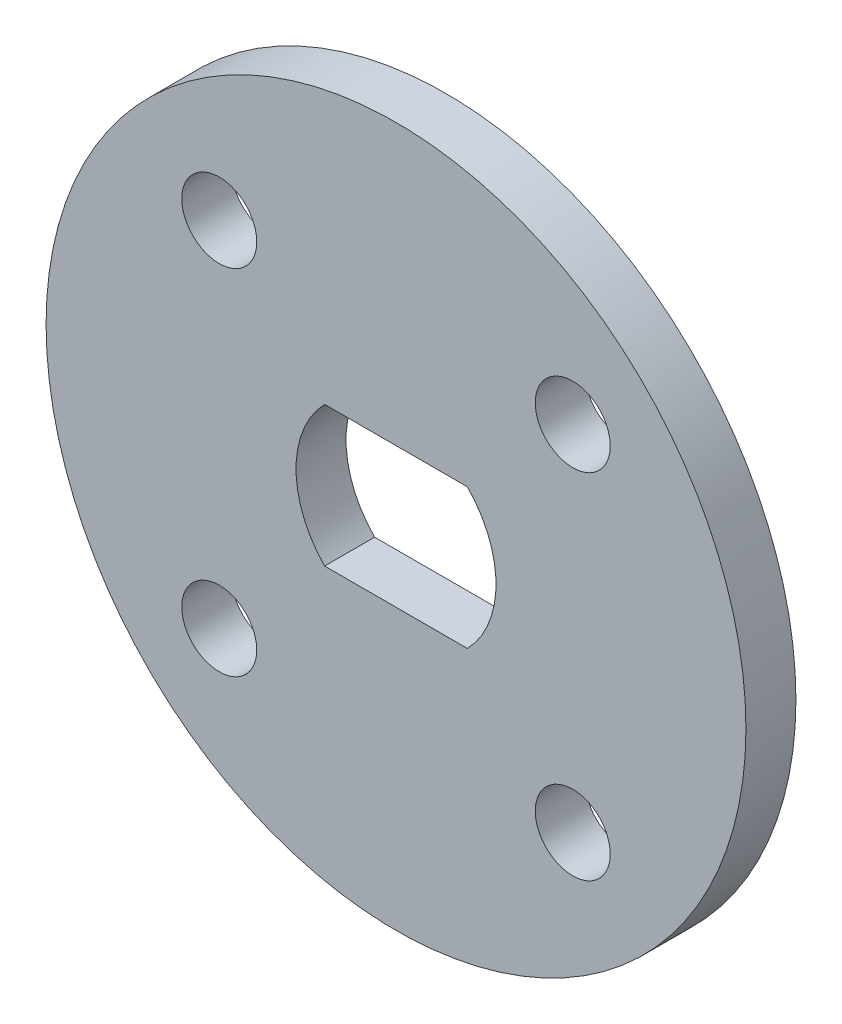
ISO-10303-21;
HEADER;
FILE_DESCRIPTION(('STEP AP214'),'2;1');
FILE_NAME('part.step','',(''),(''),'','','');
FILE_SCHEMA(('AUTOMOTIVE_DESIGN { 1 0 10303 214 1 1 1 1 }'));
ENDSEC;
DATA;
#1=APPLICATION_CONTEXT('core data for automotive mechanical design processes');
#2=APPLICATION_PROTOCOL_DEFINITION('international standard','automotive_design',2000,#1);
#3=PRODUCT_CONTEXT('',#1,'mechanical');
#4=PRODUCT('Part','Part','',(#3));
#5=PRODUCT_RELATED_PRODUCT_CATEGORY('part','',(#4));
#6=PRODUCT_DEFINITION_FORMATION('','',#4);
#7=PRODUCT_DEFINITION_CONTEXT('part definition',#1,'design');
#8=PRODUCT_DEFINITION('design','',#6,#7);
#9=PRODUCT_DEFINITION_SHAPE('','',#8);
#10=(LENGTH_UNIT() NAMED_UNIT(*) SI_UNIT(.MILLI.,.METRE.));
#11=(NAMED_UNIT(*) PLANE_ANGLE_UNIT() SI_UNIT($,.RADIAN.));
#12=(NAMED_UNIT(*) SI_UNIT($,.STERADIAN.) SOLID_ANGLE_UNIT());
#13=UNCERTAINTY_MEASURE_WITH_UNIT(LENGTH_MEASURE(1.E-05),#10,'distance_accuracy_value','');
#14=(GEOMETRIC_REPRESENTATION_CONTEXT(3) GLOBAL_UNCERTAINTY_ASSIGNED_CONTEXT((#13)) GLOBAL_UNIT_ASSIGNED_CONTEXT((#10,
#11,#12)) REPRESENTATION_CONTEXT('',''));
#15=CARTESIAN_POINT('',(0.,0.,0.));
#16=DIRECTION('',(0.,0.,1.));
#17=DIRECTION('',(1.,0.,0.));
#18=AXIS2_PLACEMENT_3D('',#15,#16,#17);
#19=CARTESIAN_POINT('',(0.,0.,2.));
#20=DIRECTION('',(0.,0.,1.));
#21=DIRECTION('',(1.,0.,0.));
#22=AXIS2_PLACEMENT_3D('',#19,#20,#21);
#23=PLANE('',#22);
#24=CARTESIAN_POINT('',(-7.07106781186549,-7.07106781186546,2.));
#25=DIRECTION('',(0.,0.,1.));
#26=DIRECTION('',(1.,0.,0.));
#27=AXIS2_PLACEMENT_3D('',#24,#25,#26);
#28=CIRCLE('',#27,1.5);
#29=CARTESIAN_POINT('',(-5.57106781186548,-7.07106781186546,2.));
#30=VERTEX_POINT('',#29);
#31=EDGE_CURVE('E148',#30,#30,#28,.T.);
#32=ORIENTED_EDGE('',*,*,#31,.F.);
#33=EDGE_LOOP('',(#32));
#34=FACE_BOUND('',#33,.T.);
#35=CARTESIAN_POINT('',(-7.07106781186546,7.07106781186549,2.));
#36=DIRECTION('',(0.,0.,1.));
#37=DIRECTION('',(1.,0.,0.));
#38=AXIS2_PLACEMENT_3D('',#35,#36,#37);
#39=CIRCLE('',#38,1.5);
#40=CARTESIAN_POINT('',(-5.57106781186546,7.07106781186549,2.));
#41=VERTEX_POINT('',#40);
#42=EDGE_CURVE('E163',#41,#41,#39,.T.);
#43=ORIENTED_EDGE('',*,*,#42,.F.);
#44=EDGE_LOOP('',(#43));
#45=FACE_BOUND('',#44,.T.);
#46=CARTESIAN_POINT('',(0.,0.,2.));
#47=DIRECTION('',(0.,0.,1.));
#48=DIRECTION('',(1.,0.,0.));
#49=AXIS2_PLACEMENT_3D('',#46,#47,#48);
#50=CIRCLE('',#49,14.);
#51=CARTESIAN_POINT('',(14.,0.,2.));
#52=VERTEX_POINT('',#51);
#53=EDGE_CURVE('E11',#52,#52,#50,.T.);
#54=ORIENTED_EDGE('',*,*,#53,.T.);
#55=EDGE_LOOP('',(#54));
#56=FACE_BOUND('',#55,.T.);
#57=CARTESIAN_POINT('',(7.07106781186544,7.07106781186551,2.));
#58=DIRECTION('',(0.,0.,1.));
#59=DIRECTION('',(1.,0.,0.));
#60=AXIS2_PLACEMENT_3D('',#57,#58,#59);
#61=CIRCLE('',#60,1.5);
#62=CARTESIAN_POINT('',(8.57106781186543,7.07106781186551,2.));
#63=VERTEX_POINT('',#62);
#64=EDGE_CURVE('E156',#63,#63,#61,.T.);
#65=ORIENTED_EDGE('',*,*,#64,.F.);
#66=EDGE_LOOP('',(#65));
#67=FACE_BOUND('',#66,.T.);
#68=CARTESIAN_POINT('',(7.07106781186546,-7.07106781186549,2.));
#69=DIRECTION('',(0.,0.,1.));
#70=DIRECTION('',(1.,0.,0.));
#71=AXIS2_PLACEMENT_3D('',#68,#69,#70);
#72=CIRCLE('',#71,1.5);
#73=CARTESIAN_POINT('',(8.57106781186546,-7.07106781186549,2.));
#74=VERTEX_POINT('',#73);
#75=EDGE_CURVE('E140',#74,#74,#72,.T.);
#76=ORIENTED_EDGE('',*,*,#75,.F.);
#77=EDGE_LOOP('',(#76));
#78=FACE_BOUND('',#77,.T.);
#79=DIRECTION('',(-1.,0.,0.));
#80=VECTOR('',#79,1.);
#81=CARTESIAN_POINT('',(0.,-2.8,2.));
#82=LINE('',#81,#80);
#83=CARTESIAN_POINT('',(2.85657137141714,-2.8,2.));
#84=VERTEX_POINT('',#83);
#85=CARTESIAN_POINT('',(-2.85657137141714,-2.8,2.));
#86=VERTEX_POINT('',#85);
#87=EDGE_CURVE('E105',#84,#86,#82,.T.);
#88=ORIENTED_EDGE('',*,*,#87,.T.);
#89=CARTESIAN_POINT('',(0.,0.,2.));
#90=DIRECTION('',(0.,0.,-1.));
#91=DIRECTION('',(-1.,0.,0.));
#92=AXIS2_PLACEMENT_3D('',#89,#90,#91);
#93=CIRCLE('',#92,4.);
#94=CARTESIAN_POINT('',(-2.85657137141714,2.8,2.));
#95=VERTEX_POINT('',#94);
#96=EDGE_CURVE('E100',#95,#86,#93,.F.);
#97=ORIENTED_EDGE('',*,*,#96,.F.);
#98=DIRECTION('',(-1.,0.,0.));
#99=VECTOR('',#98,1.);
#100=CARTESIAN_POINT('',(0.,2.8,2.));
#101=LINE('',#100,#99);
#102=CARTESIAN_POINT('',(2.85657137141714,2.8,2.));
#103=VERTEX_POINT('',#102);
#104=EDGE_CURVE('E91',#103,#95,#101,.T.);
#105=ORIENTED_EDGE('',*,*,#104,.F.);
#106=CARTESIAN_POINT('',(0.,0.,2.));
#107=DIRECTION('',(0.,0.,-1.));
#108=DIRECTION('',(-1.,0.,0.));
#109=AXIS2_PLACEMENT_3D('',#106,#107,#108);
#110=CIRCLE('',#109,4.);
#111=EDGE_CURVE('E65',#103,#84,#110,.T.);
#112=ORIENTED_EDGE('',*,*,#111,.T.);
#113=EDGE_LOOP('',(#88,#97,#105,#112));
#114=FACE_BOUND('',#113,.T.);
#115=ADVANCED_FACE('F49',(#34,#45,#56,#67,#78,#114),#23,.T.);
#116=CARTESIAN_POINT('',(0.,0.,0.));
#117=DIRECTION('',(0.,0.,1.));
#118=DIRECTION('',(1.,0.,0.));
#119=AXIS2_PLACEMENT_3D('',#116,#117,#118);
#120=PLANE('',#119);
#121=CARTESIAN_POINT('',(7.07106781186546,-7.07106781186549,0.));
#122=DIRECTION('',(0.,0.,1.));
#123=DIRECTION('',(1.,0.,0.));
#124=AXIS2_PLACEMENT_3D('',#121,#122,#123);
#125=CIRCLE('',#124,1.5);
#126=CARTESIAN_POINT('',(8.57106781186546,-7.07106781186549,0.));
#127=VERTEX_POINT('',#126);
#128=EDGE_CURVE('E134',#127,#127,#125,.T.);
#129=ORIENTED_EDGE('',*,*,#128,.T.);
#130=EDGE_LOOP('',(#129));
#131=FACE_BOUND('',#130,.T.);
#132=CARTESIAN_POINT('',(-7.07106781186549,-7.07106781186546,0.));
#133=DIRECTION('',(0.,0.,1.));
#134=DIRECTION('',(1.,0.,0.));
#135=AXIS2_PLACEMENT_3D('',#132,#133,#134);
#136=CIRCLE('',#135,1.5);
#137=CARTESIAN_POINT('',(-5.57106781186548,-7.07106781186546,0.));
#138=VERTEX_POINT('',#137);
#139=EDGE_CURVE('E144',#138,#138,#136,.T.);
#140=ORIENTED_EDGE('',*,*,#139,.T.);
#141=EDGE_LOOP('',(#140));
#142=FACE_BOUND('',#141,.T.);
#143=CARTESIAN_POINT('',(7.07106781186544,7.07106781186551,0.));
#144=DIRECTION('',(0.,0.,1.));
#145=DIRECTION('',(1.,0.,0.));
#146=AXIS2_PLACEMENT_3D('',#143,#144,#145);
#147=CIRCLE('',#146,1.5);
#148=CARTESIAN_POINT('',(8.57106781186543,7.07106781186551,0.));
#149=VERTEX_POINT('',#148);
#150=EDGE_CURVE('E152',#149,#149,#147,.T.);
#151=ORIENTED_EDGE('',*,*,#150,.T.);
#152=EDGE_LOOP('',(#151));
#153=FACE_BOUND('',#152,.T.);
#154=CARTESIAN_POINT('',(-7.07106781186546,7.07106781186549,0.));
#155=DIRECTION('',(0.,0.,1.));
#156=DIRECTION('',(1.,0.,0.));
#157=AXIS2_PLACEMENT_3D('',#154,#155,#156);
#158=CIRCLE('',#157,1.5);
#159=CARTESIAN_POINT('',(-5.57106781186546,7.07106781186549,0.));
#160=VERTEX_POINT('',#159);
#161=EDGE_CURVE('E159',#160,#160,#158,.T.);
#162=ORIENTED_EDGE('',*,*,#161,.T.);
#163=EDGE_LOOP('',(#162));
#164=FACE_BOUND('',#163,.T.);
#165=CARTESIAN_POINT('',(0.,0.,0.));
#166=DIRECTION('',(0.,0.,1.));
#167=DIRECTION('',(1.,0.,0.));
#168=AXIS2_PLACEMENT_3D('',#165,#166,#167);
#169=CIRCLE('',#168,14.);
#170=CARTESIAN_POINT('',(14.,0.,0.));
#171=VERTEX_POINT('',#170);
#172=EDGE_CURVE('E53',#171,#171,#169,.T.);
#173=ORIENTED_EDGE('',*,*,#172,.F.);
#174=EDGE_LOOP('',(#173));
#175=FACE_BOUND('',#174,.T.);
#176=CARTESIAN_POINT('',(0.,0.,0.));
#177=DIRECTION('',(0.,0.,-1.));
#178=DIRECTION('',(-1.,0.,0.));
#179=AXIS2_PLACEMENT_3D('',#176,#177,#178);
#180=CIRCLE('',#179,4.);
#181=CARTESIAN_POINT('',(-2.85657137141714,2.8,0.));
#182=VERTEX_POINT('',#181);
#183=CARTESIAN_POINT('',(-2.85657137141714,-2.8,0.));
#184=VERTEX_POINT('',#183);
#185=EDGE_CURVE('E73',#182,#184,#180,.F.);
#186=ORIENTED_EDGE('',*,*,#185,.T.);
#187=DIRECTION('',(-1.,0.,0.));
#188=VECTOR('',#187,1.);
#189=CARTESIAN_POINT('',(0.,-2.8,0.));
#190=LINE('',#189,#188);
#191=CARTESIAN_POINT('',(2.85657137141714,-2.8,0.));
#192=VERTEX_POINT('',#191);
#193=EDGE_CURVE('E110',#192,#184,#190,.T.);
#194=ORIENTED_EDGE('',*,*,#193,.F.);
#195=CARTESIAN_POINT('',(0.,0.,0.));
#196=DIRECTION('',(0.,0.,-1.));
#197=DIRECTION('',(-1.,0.,0.));
#198=AXIS2_PLACEMENT_3D('',#195,#196,#197);
#199=CIRCLE('',#198,4.);
#200=CARTESIAN_POINT('',(2.85657137141714,2.8,0.));
#201=VERTEX_POINT('',#200);
#202=EDGE_CURVE('E117',#201,#192,#199,.T.);
#203=ORIENTED_EDGE('',*,*,#202,.F.);
#204=DIRECTION('',(-1.,0.,0.));
#205=VECTOR('',#204,1.);
#206=CARTESIAN_POINT('',(0.,2.8,0.));
#207=LINE('',#206,#205);
#208=EDGE_CURVE('E125',#201,#182,#207,.T.);
#209=ORIENTED_EDGE('',*,*,#208,.T.);
#210=EDGE_LOOP('',(#186,#194,#203,#209));
#211=FACE_BOUND('',#210,.T.);
#212=ADVANCED_FACE('F172',(#131,#142,#153,#164,#175,#211),#120,.F.);
#213=CARTESIAN_POINT('',(0.,0.,2.));
#214=DIRECTION('',(0.,0.,-1.));
#215=DIRECTION('',(-1.,0.,0.));
#216=AXIS2_PLACEMENT_3D('',#213,#214,#215);
#217=CYLINDRICAL_SURFACE('',#216,14.);
#218=ORIENTED_EDGE('',*,*,#53,.F.);
#219=EDGE_LOOP('',(#218));
#220=FACE_BOUND('',#219,.T.);
#221=ORIENTED_EDGE('',*,*,#172,.T.);
#222=EDGE_LOOP('',(#221));
#223=FACE_BOUND('',#222,.T.);
#224=ADVANCED_FACE('F51',(#220,#223),#217,.T.);
#225=CARTESIAN_POINT('',(-7.07106781186546,7.07106781186549,2.));
#226=DIRECTION('',(0.,0.,-1.));
#227=DIRECTION('',(-1.,0.,0.));
#228=AXIS2_PLACEMENT_3D('',#225,#226,#227);
#229=CYLINDRICAL_SURFACE('',#228,1.5);
#230=ORIENTED_EDGE('',*,*,#42,.T.);
#231=EDGE_LOOP('',(#230));
#232=FACE_BOUND('',#231,.T.);
#233=ORIENTED_EDGE('',*,*,#161,.F.);
#234=EDGE_LOOP('',(#233));
#235=FACE_BOUND('',#234,.T.);
#236=ADVANCED_FACE('F175',(#232,#235),#229,.F.);
#237=CARTESIAN_POINT('',(7.07106781186544,7.07106781186551,2.));
#238=DIRECTION('',(0.,0.,-1.));
#239=DIRECTION('',(-1.,0.,0.));
#240=AXIS2_PLACEMENT_3D('',#237,#238,#239);
#241=CYLINDRICAL_SURFACE('',#240,1.5);
#242=ORIENTED_EDGE('',*,*,#64,.T.);
#243=EDGE_LOOP('',(#242));
#244=FACE_BOUND('',#243,.T.);
#245=ORIENTED_EDGE('',*,*,#150,.F.);
#246=EDGE_LOOP('',(#245));
#247=FACE_BOUND('',#246,.T.);
#248=ADVANCED_FACE('F177',(#244,#247),#241,.F.);
#249=CARTESIAN_POINT('',(-7.07106781186549,-7.07106781186546,2.));
#250=DIRECTION('',(0.,0.,-1.));
#251=DIRECTION('',(-1.,0.,0.));
#252=AXIS2_PLACEMENT_3D('',#249,#250,#251);
#253=CYLINDRICAL_SURFACE('',#252,1.5);
#254=ORIENTED_EDGE('',*,*,#31,.T.);
#255=EDGE_LOOP('',(#254));
#256=FACE_BOUND('',#255,.T.);
#257=ORIENTED_EDGE('',*,*,#139,.F.);
#258=EDGE_LOOP('',(#257));
#259=FACE_BOUND('',#258,.T.);
#260=ADVANCED_FACE('F183',(#256,#259),#253,.F.);
#261=CARTESIAN_POINT('',(7.07106781186546,-7.07106781186549,2.));
#262=DIRECTION('',(0.,0.,-1.));
#263=DIRECTION('',(-1.,0.,0.));
#264=AXIS2_PLACEMENT_3D('',#261,#262,#263);
#265=CYLINDRICAL_SURFACE('',#264,1.5);
#266=ORIENTED_EDGE('',*,*,#75,.T.);
#267=EDGE_LOOP('',(#266));
#268=FACE_BOUND('',#267,.T.);
#269=ORIENTED_EDGE('',*,*,#128,.F.);
#270=EDGE_LOOP('',(#269));
#271=FACE_BOUND('',#270,.T.);
#272=ADVANCED_FACE('F203',(#268,#271),#265,.F.);
#273=CARTESIAN_POINT('',(0.,0.,2.));
#274=DIRECTION('',(0.,0.,-1.));
#275=DIRECTION('',(-1.,0.,0.));
#276=AXIS2_PLACEMENT_3D('',#273,#274,#275);
#277=CYLINDRICAL_SURFACE('',#276,4.);
#278=ORIENTED_EDGE('',*,*,#185,.F.);
#279=DIRECTION('',(0.,0.,-1.));
#280=VECTOR('',#279,1.);
#281=CARTESIAN_POINT('',(-2.85657137141714,2.8,2.));
#282=LINE('',#281,#280);
#283=EDGE_CURVE('E94',#95,#182,#282,.T.);
#284=ORIENTED_EDGE('',*,*,#283,.F.);
#285=ORIENTED_EDGE('',*,*,#96,.T.);
#286=DIRECTION('',(0.,0.,-1.));
#287=VECTOR('',#286,1.);
#288=CARTESIAN_POINT('',(-2.85657137141714,-2.8,2.));
#289=LINE('',#288,#287);
#290=EDGE_CURVE('E131',#86,#184,#289,.T.);
#291=ORIENTED_EDGE('',*,*,#290,.T.);
#292=EDGE_LOOP('',(#278,#284,#285,#291));
#293=FACE_BOUND('',#292,.T.);
#294=ADVANCED_FACE('F102',(#293),#277,.F.);
#295=CARTESIAN_POINT('',(0.,-2.8,2.));
#296=DIRECTION('',(0.,-1.,0.));
#297=DIRECTION('',(0.,0.,-1.));
#298=AXIS2_PLACEMENT_3D('',#295,#296,#297);
#299=PLANE('',#298);
#300=ORIENTED_EDGE('',*,*,#193,.T.);
#301=ORIENTED_EDGE('',*,*,#290,.F.);
#302=ORIENTED_EDGE('',*,*,#87,.F.);
#303=DIRECTION('',(0.,0.,-1.));
#304=VECTOR('',#303,1.);
#305=CARTESIAN_POINT('',(2.85657137141714,-2.8,2.));
#306=LINE('',#305,#304);
#307=EDGE_CURVE('E135',#84,#192,#306,.T.);
#308=ORIENTED_EDGE('',*,*,#307,.T.);
#309=EDGE_LOOP('',(#300,#301,#302,#308));
#310=FACE_BOUND('',#309,.T.);
#311=ADVANCED_FACE('F221',(#310),#299,.F.);
#312=CARTESIAN_POINT('',(0.,0.,2.));
#313=DIRECTION('',(0.,0.,-1.));
#314=DIRECTION('',(-1.,0.,0.));
#315=AXIS2_PLACEMENT_3D('',#312,#313,#314);
#316=CYLINDRICAL_SURFACE('',#315,4.);
#317=ORIENTED_EDGE('',*,*,#202,.T.);
#318=ORIENTED_EDGE('',*,*,#307,.F.);
#319=ORIENTED_EDGE('',*,*,#111,.F.);
#320=DIRECTION('',(0.,0.,-1.));
#321=VECTOR('',#320,1.);
#322=CARTESIAN_POINT('',(2.85657137141714,2.8,2.));
#323=LINE('',#322,#321);
#324=EDGE_CURVE('E96',#103,#201,#323,.T.);
#325=ORIENTED_EDGE('',*,*,#324,.T.);
#326=EDGE_LOOP('',(#317,#318,#319,#325));
#327=FACE_BOUND('',#326,.T.);
#328=ADVANCED_FACE('F224',(#327),#316,.F.);
#329=CARTESIAN_POINT('',(0.,2.8,2.));
#330=DIRECTION('',(0.,-1.,0.));
#331=DIRECTION('',(0.,0.,-1.));
#332=AXIS2_PLACEMENT_3D('',#329,#330,#331);
#333=PLANE('',#332);
#334=ORIENTED_EDGE('',*,*,#208,.F.);
#335=ORIENTED_EDGE('',*,*,#324,.F.);
#336=ORIENTED_EDGE('',*,*,#104,.T.);
#337=ORIENTED_EDGE('',*,*,#283,.T.);
#338=EDGE_LOOP('',(#334,#335,#336,#337));
#339=FACE_BOUND('',#338,.T.);
#340=ADVANCED_FACE('F93',(#339),#333,.T.);
#341=CLOSED_SHELL('',(#115,#212,#224,#236,#248,#260,#272,#294,#311,#328,#340));
#342=MANIFOLD_SOLID_BREP('B2',#341);
#343=ADVANCED_BREP_SHAPE_REPRESENTATION('',(#18,#342),#14);
#344=SHAPE_DEFINITION_REPRESENTATION(#9,#343);
ENDSEC;
END-ISO-10303-21;
